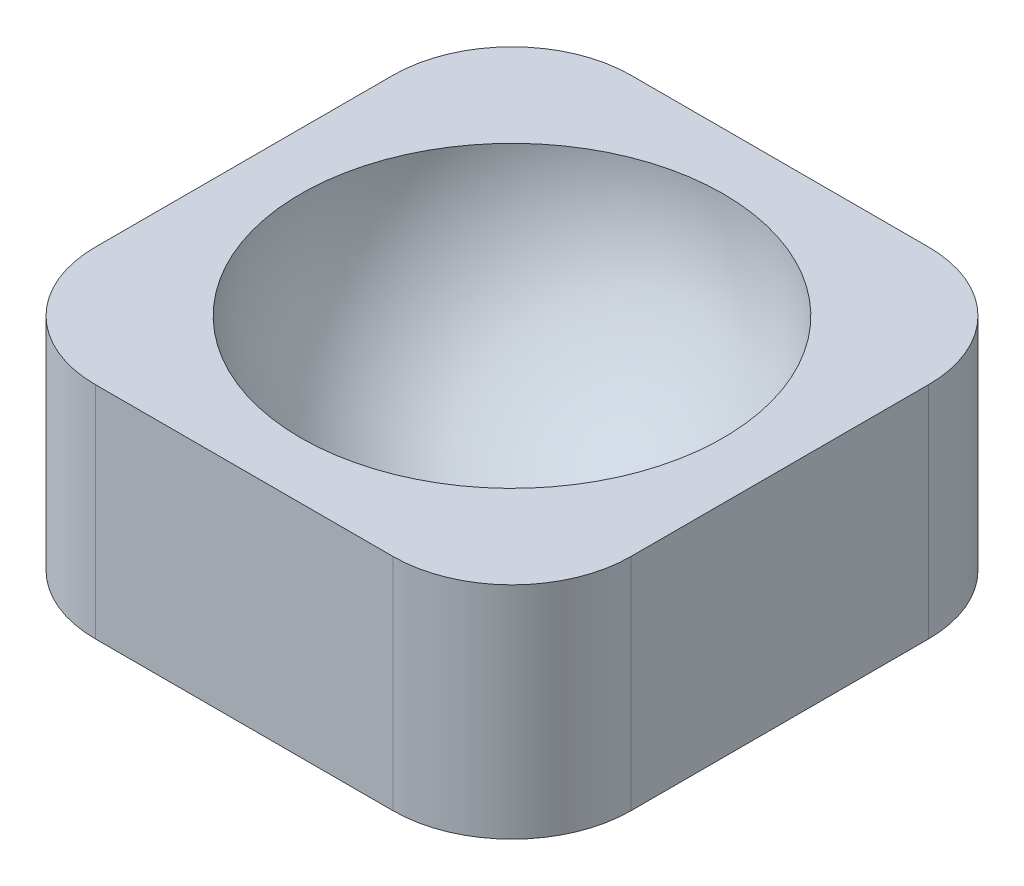
ISO-10303-21;
HEADER;
FILE_DESCRIPTION(('STEP AP214'),'2;1');
FILE_NAME('part.step','',(''),(''),'','','');
FILE_SCHEMA(('AUTOMOTIVE_DESIGN { 1 0 10303 214 1 1 1 1 }'));
ENDSEC;
DATA;
#1=APPLICATION_CONTEXT('core data for automotive mechanical design processes');
#2=APPLICATION_PROTOCOL_DEFINITION('international standard','automotive_design',2000,#1);
#3=PRODUCT_CONTEXT('',#1,'mechanical');
#4=PRODUCT('Part','Part','',(#3));
#5=PRODUCT_RELATED_PRODUCT_CATEGORY('part','',(#4));
#6=PRODUCT_DEFINITION_FORMATION('','',#4);
#7=PRODUCT_DEFINITION_CONTEXT('part definition',#1,'design');
#8=PRODUCT_DEFINITION('design','',#6,#7);
#9=PRODUCT_DEFINITION_SHAPE('','',#8);
#10=(LENGTH_UNIT() NAMED_UNIT(*) SI_UNIT(.MILLI.,.METRE.));
#11=(NAMED_UNIT(*) PLANE_ANGLE_UNIT() SI_UNIT($,.RADIAN.));
#12=(NAMED_UNIT(*) SI_UNIT($,.STERADIAN.) SOLID_ANGLE_UNIT());
#13=UNCERTAINTY_MEASURE_WITH_UNIT(LENGTH_MEASURE(1.E-05),#10,'distance_accuracy_value','');
#14=(GEOMETRIC_REPRESENTATION_CONTEXT(3) GLOBAL_UNCERTAINTY_ASSIGNED_CONTEXT((#13)) GLOBAL_UNIT_ASSIGNED_CONTEXT((#10,
#11,#12)) REPRESENTATION_CONTEXT('',''));
#15=CARTESIAN_POINT('',(0.,0.,0.));
#16=DIRECTION('',(0.,0.,1.));
#17=DIRECTION('',(1.,0.,0.));
#18=AXIS2_PLACEMENT_3D('',#15,#16,#17);
#19=CARTESIAN_POINT('',(-114.3,46.99,0.));
#20=DIRECTION('',(-1.,0.,0.));
#21=DIRECTION('',(0.,0.,1.));
#22=AXIS2_PLACEMENT_3D('',#19,#20,#21);
#23=PLANE('',#22);
#24=DIRECTION('',(0.,0.,-1.));
#25=VECTOR('',#24,1.);
#26=CARTESIAN_POINT('',(-114.3,0.,0.));
#27=LINE('',#26,#25);
#28=CARTESIAN_POINT('',(-114.3,0.,-25.4));
#29=VERTEX_POINT('',#28);
#30=CARTESIAN_POINT('',(-114.3,0.,-88.8999999999998));
#31=VERTEX_POINT('',#30);
#32=EDGE_CURVE('E133',#29,#31,#27,.T.);
#33=ORIENTED_EDGE('',*,*,#32,.F.);
#34=DIRECTION('',(0.,-1.,0.));
#35=VECTOR('',#34,1.);
#36=CARTESIAN_POINT('',(-114.3,46.99,-25.4));
#37=LINE('',#36,#35);
#38=CARTESIAN_POINT('',(-114.3,46.99,-25.4));
#39=VERTEX_POINT('',#38);
#40=EDGE_CURVE('E156',#29,#39,#37,.F.);
#41=ORIENTED_EDGE('',*,*,#40,.T.);
#42=DIRECTION('',(0.,0.,-1.));
#43=VECTOR('',#42,1.);
#44=CARTESIAN_POINT('',(-114.3,46.99,0.));
#45=LINE('',#44,#43);
#46=CARTESIAN_POINT('',(-114.3,46.99,-88.8999999999998));
#47=VERTEX_POINT('',#46);
#48=EDGE_CURVE('E131',#39,#47,#45,.T.);
#49=ORIENTED_EDGE('',*,*,#48,.T.);
#50=DIRECTION('',(0.,-1.,0.));
#51=VECTOR('',#50,1.);
#52=CARTESIAN_POINT('',(-114.3,0.,-88.8999999999998));
#53=LINE('',#52,#51);
#54=EDGE_CURVE('E153',#47,#31,#53,.T.);
#55=ORIENTED_EDGE('',*,*,#54,.T.);
#56=EDGE_LOOP('',(#33,#41,#49,#55));
#57=FACE_BOUND('',#56,.T.);
#58=ADVANCED_FACE('F38',(#57),#23,.T.);
#59=CARTESIAN_POINT('',(0.,46.99,0.));
#60=DIRECTION('',(0.,0.,1.));
#61=DIRECTION('',(1.,0.,0.));
#62=AXIS2_PLACEMENT_3D('',#59,#60,#61);
#63=PLANE('',#62);
#64=DIRECTION('',(-1.,0.,0.));
#65=VECTOR('',#64,1.);
#66=CARTESIAN_POINT('',(0.,0.,0.));
#67=LINE('',#66,#65);
#68=CARTESIAN_POINT('',(-25.4,0.,0.));
#69=VERTEX_POINT('',#68);
#70=CARTESIAN_POINT('',(-88.9000000000001,0.,0.));
#71=VERTEX_POINT('',#70);
#72=EDGE_CURVE('E129',#69,#71,#67,.T.);
#73=ORIENTED_EDGE('',*,*,#72,.F.);
#74=DIRECTION('',(0.,-1.,0.));
#75=VECTOR('',#74,1.);
#76=CARTESIAN_POINT('',(-25.4,46.99,0.));
#77=LINE('',#76,#75);
#78=CARTESIAN_POINT('',(-25.4,46.99,0.));
#79=VERTEX_POINT('',#78);
#80=EDGE_CURVE('E108',#69,#79,#77,.F.);
#81=ORIENTED_EDGE('',*,*,#80,.T.);
#82=DIRECTION('',(-1.,0.,0.));
#83=VECTOR('',#82,1.);
#84=CARTESIAN_POINT('',(0.,46.99,0.));
#85=LINE('',#84,#83);
#86=CARTESIAN_POINT('',(-88.9000000000001,46.99,0.));
#87=VERTEX_POINT('',#86);
#88=EDGE_CURVE('E172',#79,#87,#85,.T.);
#89=ORIENTED_EDGE('',*,*,#88,.T.);
#90=DIRECTION('',(0.,-1.,0.));
#91=VECTOR('',#90,1.);
#92=CARTESIAN_POINT('',(-88.9000000000001,46.99,0.));
#93=LINE('',#92,#91);
#94=EDGE_CURVE('E113',#87,#71,#93,.T.);
#95=ORIENTED_EDGE('',*,*,#94,.T.);
#96=EDGE_LOOP('',(#73,#81,#89,#95));
#97=FACE_BOUND('',#96,.T.);
#98=ADVANCED_FACE('F197',(#97),#63,.T.);
#99=CARTESIAN_POINT('',(0.,46.99,0.));
#100=DIRECTION('',(-1.,0.,0.));
#101=DIRECTION('',(0.,0.,1.));
#102=AXIS2_PLACEMENT_3D('',#99,#100,#101);
#103=PLANE('',#102);
#104=DIRECTION('',(0.,0.,-1.));
#105=VECTOR('',#104,1.);
#106=CARTESIAN_POINT('',(0.,46.99,0.));
#107=LINE('',#106,#105);
#108=CARTESIAN_POINT('',(0.,46.99,-25.4));
#109=VERTEX_POINT('',#108);
#110=CARTESIAN_POINT('',(0.,46.99,-88.8999999999999));
#111=VERTEX_POINT('',#110);
#112=EDGE_CURVE('E122',#109,#111,#107,.T.);
#113=ORIENTED_EDGE('',*,*,#112,.F.);
#114=DIRECTION('',(0.,-1.,0.));
#115=VECTOR('',#114,1.);
#116=CARTESIAN_POINT('',(0.,0.,-25.4));
#117=LINE('',#116,#115);
#118=CARTESIAN_POINT('',(0.,0.,-25.4));
#119=VERTEX_POINT('',#118);
#120=EDGE_CURVE('E107',#109,#119,#117,.T.);
#121=ORIENTED_EDGE('',*,*,#120,.T.);
#122=DIRECTION('',(0.,0.,-1.));
#123=VECTOR('',#122,1.);
#124=CARTESIAN_POINT('',(0.,0.,0.));
#125=LINE('',#124,#123);
#126=CARTESIAN_POINT('',(0.,0.,-88.8999999999999));
#127=VERTEX_POINT('',#126);
#128=EDGE_CURVE('E120',#119,#127,#125,.T.);
#129=ORIENTED_EDGE('',*,*,#128,.T.);
#130=DIRECTION('',(0.,-1.,0.));
#131=VECTOR('',#130,1.);
#132=CARTESIAN_POINT('',(0.,46.99,-88.8999999999999));
#133=LINE('',#132,#131);
#134=EDGE_CURVE('E124',#127,#111,#133,.F.);
#135=ORIENTED_EDGE('',*,*,#134,.T.);
#136=EDGE_LOOP('',(#113,#121,#129,#135));
#137=FACE_BOUND('',#136,.T.);
#138=ADVANCED_FACE('F119',(#137),#103,.F.);
#139=CARTESIAN_POINT('',(-1.52655665885959E-13,46.99,-114.3));
#140=DIRECTION('',(0.,0.,1.));
#141=DIRECTION('',(1.,0.,0.));
#142=AXIS2_PLACEMENT_3D('',#139,#140,#141);
#143=PLANE('',#142);
#144=DIRECTION('',(-1.,0.,0.));
#145=VECTOR('',#144,1.);
#146=CARTESIAN_POINT('',(-1.52655665885959E-13,0.,-114.3));
#147=LINE('',#146,#145);
#148=CARTESIAN_POINT('',(-25.4,0.,-114.3));
#149=VERTEX_POINT('',#148);
#150=CARTESIAN_POINT('',(-88.9000000000001,0.,-114.3));
#151=VERTEX_POINT('',#150);
#152=EDGE_CURVE('E128',#149,#151,#147,.T.);
#153=ORIENTED_EDGE('',*,*,#152,.T.);
#154=DIRECTION('',(0.,-1.,0.));
#155=VECTOR('',#154,1.);
#156=CARTESIAN_POINT('',(-88.9000000000001,46.99,-114.3));
#157=LINE('',#156,#155);
#158=CARTESIAN_POINT('',(-88.9000000000001,46.99,-114.3));
#159=VERTEX_POINT('',#158);
#160=EDGE_CURVE('E11',#151,#159,#157,.F.);
#161=ORIENTED_EDGE('',*,*,#160,.T.);
#162=DIRECTION('',(-1.,0.,0.));
#163=VECTOR('',#162,1.);
#164=CARTESIAN_POINT('',(-1.52655665885959E-13,46.99,-114.3));
#165=LINE('',#164,#163);
#166=CARTESIAN_POINT('',(-25.4,46.99,-114.3));
#167=VERTEX_POINT('',#166);
#168=EDGE_CURVE('E137',#167,#159,#165,.T.);
#169=ORIENTED_EDGE('',*,*,#168,.F.);
#170=DIRECTION('',(0.,-1.,0.));
#171=VECTOR('',#170,1.);
#172=CARTESIAN_POINT('',(-25.4,46.99,-114.3));
#173=LINE('',#172,#171);
#174=EDGE_CURVE('E46',#167,#149,#173,.T.);
#175=ORIENTED_EDGE('',*,*,#174,.T.);
#176=EDGE_LOOP('',(#153,#161,#169,#175));
#177=FACE_BOUND('',#176,.T.);
#178=ADVANCED_FACE('F159',(#177),#143,.F.);
#179=CARTESIAN_POINT('',(0.,46.99,0.));
#180=DIRECTION('',(0.,1.,0.));
#181=DIRECTION('',(0.,0.,1.));
#182=AXIS2_PLACEMENT_3D('',#179,#180,#181);
#183=PLANE('',#182);
#184=CARTESIAN_POINT('',(-57.15,46.99,-57.15));
#185=DIRECTION('',(0.,-1.,0.));
#186=DIRECTION('',(0.,0.,1.));
#187=AXIS2_PLACEMENT_3D('',#184,#185,#186);
#188=CIRCLE('',#187,45.085);
#189=CARTESIAN_POINT('',(-57.15,46.99,-12.065));
#190=VERTEX_POINT('',#189);
#191=EDGE_CURVE('E177',#190,#190,#188,.T.);
#192=ORIENTED_EDGE('',*,*,#191,.T.);
#193=EDGE_LOOP('',(#192));
#194=FACE_BOUND('',#193,.T.);
#195=ORIENTED_EDGE('',*,*,#88,.F.);
#196=CARTESIAN_POINT('',(-25.4,46.99,-25.4));
#197=DIRECTION('',(0.,1.,0.));
#198=DIRECTION('',(0.,0.,1.));
#199=AXIS2_PLACEMENT_3D('',#196,#197,#198);
#200=CIRCLE('',#199,25.4);
#201=EDGE_CURVE('E151',#79,#109,#200,.T.);
#202=ORIENTED_EDGE('',*,*,#201,.T.);
#203=ORIENTED_EDGE('',*,*,#112,.T.);
#204=CARTESIAN_POINT('',(-25.4,46.99,-88.8999999999999));
#205=DIRECTION('',(0.,1.,0.));
#206=DIRECTION('',(0.,0.,1.));
#207=AXIS2_PLACEMENT_3D('',#204,#205,#206);
#208=CIRCLE('',#207,25.4);
#209=EDGE_CURVE('E58',#111,#167,#208,.T.);
#210=ORIENTED_EDGE('',*,*,#209,.T.);
#211=ORIENTED_EDGE('',*,*,#168,.T.);
#212=CARTESIAN_POINT('',(-88.9000000000001,46.99,-88.8999999999998));
#213=DIRECTION('',(0.,1.,0.));
#214=DIRECTION('',(0.,0.,1.));
#215=AXIS2_PLACEMENT_3D('',#212,#213,#214);
#216=CIRCLE('',#215,25.4);
#217=EDGE_CURVE('E147',#159,#47,#216,.T.);
#218=ORIENTED_EDGE('',*,*,#217,.T.);
#219=ORIENTED_EDGE('',*,*,#48,.F.);
#220=CARTESIAN_POINT('',(-88.9000000000001,46.99,-25.4));
#221=DIRECTION('',(0.,1.,0.));
#222=DIRECTION('',(0.,0.,1.));
#223=AXIS2_PLACEMENT_3D('',#220,#221,#222);
#224=CIRCLE('',#223,25.4);
#225=EDGE_CURVE('E149',#39,#87,#224,.T.);
#226=ORIENTED_EDGE('',*,*,#225,.T.);
#227=EDGE_LOOP('',(#195,#202,#203,#210,#211,#218,#219,#226));
#228=FACE_BOUND('',#227,.T.);
#229=ADVANCED_FACE('F183',(#194,#228),#183,.T.);
#230=CARTESIAN_POINT('',(0.,0.,0.));
#231=DIRECTION('',(0.,1.,0.));
#232=DIRECTION('',(0.,0.,1.));
#233=AXIS2_PLACEMENT_3D('',#230,#231,#232);
#234=PLANE('',#233);
#235=ORIENTED_EDGE('',*,*,#128,.F.);
#236=CARTESIAN_POINT('',(-25.4,0.,-25.4));
#237=DIRECTION('',(0.,1.,0.));
#238=DIRECTION('',(0.,0.,1.));
#239=AXIS2_PLACEMENT_3D('',#236,#237,#238);
#240=CIRCLE('',#239,25.4);
#241=EDGE_CURVE('E103',#119,#69,#240,.F.);
#242=ORIENTED_EDGE('',*,*,#241,.T.);
#243=ORIENTED_EDGE('',*,*,#72,.T.);
#244=CARTESIAN_POINT('',(-88.9000000000001,0.,-25.4));
#245=DIRECTION('',(0.,1.,0.));
#246=DIRECTION('',(0.,0.,1.));
#247=AXIS2_PLACEMENT_3D('',#244,#245,#246);
#248=CIRCLE('',#247,25.4);
#249=EDGE_CURVE('E114',#71,#29,#248,.F.);
#250=ORIENTED_EDGE('',*,*,#249,.T.);
#251=ORIENTED_EDGE('',*,*,#32,.T.);
#252=CARTESIAN_POINT('',(-88.9000000000001,0.,-88.8999999999998));
#253=DIRECTION('',(0.,1.,0.));
#254=DIRECTION('',(0.,0.,1.));
#255=AXIS2_PLACEMENT_3D('',#252,#253,#254);
#256=CIRCLE('',#255,25.4);
#257=EDGE_CURVE('E140',#31,#151,#256,.F.);
#258=ORIENTED_EDGE('',*,*,#257,.T.);
#259=ORIENTED_EDGE('',*,*,#152,.F.);
#260=CARTESIAN_POINT('',(-25.4,0.,-88.8999999999999));
#261=DIRECTION('',(0.,1.,0.));
#262=DIRECTION('',(0.,0.,1.));
#263=AXIS2_PLACEMENT_3D('',#260,#261,#262);
#264=CIRCLE('',#263,25.4);
#265=EDGE_CURVE('E123',#149,#127,#264,.F.);
#266=ORIENTED_EDGE('',*,*,#265,.T.);
#267=EDGE_LOOP('',(#235,#242,#243,#250,#251,#258,#259,#266));
#268=FACE_BOUND('',#267,.T.);
#269=ADVANCED_FACE('F126',(#268),#234,.F.);
#270=CARTESIAN_POINT('',(-57.15,46.99,-57.15));
#271=DIRECTION('',(0.,0.,1.));
#272=DIRECTION('',(-1.,0.,0.));
#273=AXIS2_PLACEMENT_3D('',#270,#271,#272);
#274=SPHERICAL_SURFACE('',#273,45.085);
#275=CARTESIAN_POINT('',(-57.15,46.99,-57.15));
#276=DIRECTION('',(0.,-1.,0.));
#277=DIRECTION('',(0.,0.,1.));
#278=AXIS2_PLACEMENT_3D('',#275,#276,#277);
#279=SPHERICAL_SURFACE('',#278,45.085);
#280=ORIENTED_EDGE('',*,*,#191,.F.);
#281=EDGE_LOOP('',(#280));
#282=FACE_BOUND('',#281,.T.);
#283=ADVANCED_FACE('F185',(#282),#279,.F.);
#284=CARTESIAN_POINT('',(-25.4,46.99,-25.4));
#285=DIRECTION('',(0.,1.,0.));
#286=DIRECTION('',(0.,0.,1.));
#287=AXIS2_PLACEMENT_3D('',#284,#285,#286);
#288=CYLINDRICAL_SURFACE('',#287,25.4);
#289=ORIENTED_EDGE('',*,*,#201,.F.);
#290=ORIENTED_EDGE('',*,*,#80,.F.);
#291=ORIENTED_EDGE('',*,*,#241,.F.);
#292=ORIENTED_EDGE('',*,*,#120,.F.);
#293=EDGE_LOOP('',(#289,#290,#291,#292));
#294=FACE_BOUND('',#293,.T.);
#295=ADVANCED_FACE('F106',(#294),#288,.T.);
#296=CARTESIAN_POINT('',(-88.9000000000001,46.99,-25.4));
#297=DIRECTION('',(0.,-1.,0.));
#298=DIRECTION('',(0.,0.,-1.));
#299=AXIS2_PLACEMENT_3D('',#296,#297,#298);
#300=CYLINDRICAL_SURFACE('',#299,25.4);
#301=ORIENTED_EDGE('',*,*,#225,.F.);
#302=ORIENTED_EDGE('',*,*,#40,.F.);
#303=ORIENTED_EDGE('',*,*,#249,.F.);
#304=ORIENTED_EDGE('',*,*,#94,.F.);
#305=EDGE_LOOP('',(#301,#302,#303,#304));
#306=FACE_BOUND('',#305,.T.);
#307=ADVANCED_FACE('F192',(#306),#300,.T.);
#308=CARTESIAN_POINT('',(-88.9000000000001,46.99,-88.8999999999998));
#309=DIRECTION('',(0.,1.,0.));
#310=DIRECTION('',(0.,0.,1.));
#311=AXIS2_PLACEMENT_3D('',#308,#309,#310);
#312=CYLINDRICAL_SURFACE('',#311,25.4);
#313=ORIENTED_EDGE('',*,*,#217,.F.);
#314=ORIENTED_EDGE('',*,*,#160,.F.);
#315=ORIENTED_EDGE('',*,*,#257,.F.);
#316=ORIENTED_EDGE('',*,*,#54,.F.);
#317=EDGE_LOOP('',(#313,#314,#315,#316));
#318=FACE_BOUND('',#317,.T.);
#319=ADVANCED_FACE('F166',(#318),#312,.T.);
#320=CARTESIAN_POINT('',(-25.4,46.99,-88.8999999999999));
#321=DIRECTION('',(0.,-1.,0.));
#322=DIRECTION('',(0.,0.,-1.));
#323=AXIS2_PLACEMENT_3D('',#320,#321,#322);
#324=CYLINDRICAL_SURFACE('',#323,25.4);
#325=ORIENTED_EDGE('',*,*,#209,.F.);
#326=ORIENTED_EDGE('',*,*,#134,.F.);
#327=ORIENTED_EDGE('',*,*,#265,.F.);
#328=ORIENTED_EDGE('',*,*,#174,.F.);
#329=EDGE_LOOP('',(#325,#326,#327,#328));
#330=FACE_BOUND('',#329,.T.);
#331=ADVANCED_FACE('F40',(#330),#324,.T.);
#332=CLOSED_SHELL('',(#58,#98,#138,#178,#229,#269,#283,#295,#307,#319,#331));
#333=MANIFOLD_SOLID_BREP('B2',#332);
#334=ADVANCED_BREP_SHAPE_REPRESENTATION('',(#18,#333),#14);
#335=SHAPE_DEFINITION_REPRESENTATION(#9,#334);
ENDSEC;
END-ISO-10303-21;
